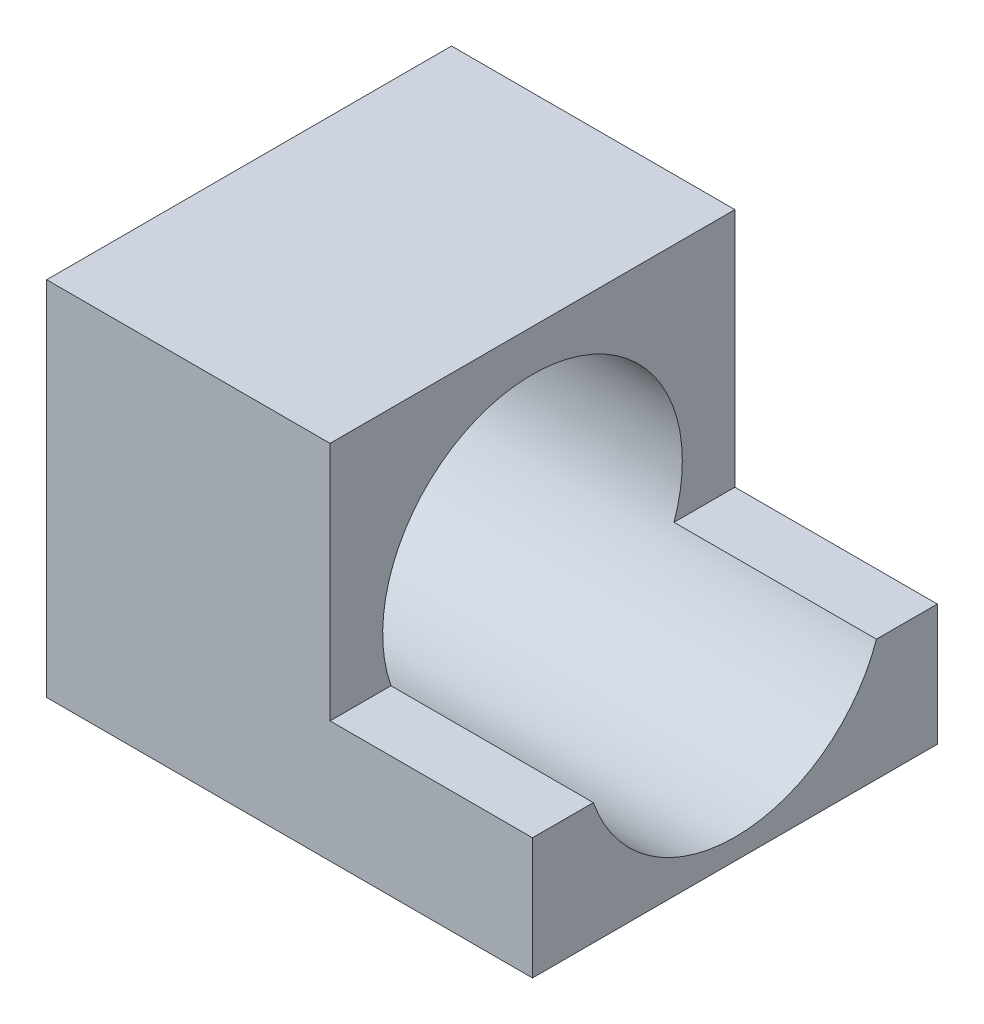
ISO-10303-21;
HEADER;
FILE_DESCRIPTION(('STEP AP214'),'2;1');
FILE_NAME('part.step','',(''),(''),'','','');
FILE_SCHEMA(('AUTOMOTIVE_DESIGN { 1 0 10303 214 1 1 1 1 }'));
ENDSEC;
DATA;
#1=APPLICATION_CONTEXT('core data for automotive mechanical design processes');
#2=APPLICATION_PROTOCOL_DEFINITION('international standard','automotive_design',2000,#1);
#3=PRODUCT_CONTEXT('',#1,'mechanical');
#4=PRODUCT('Part','Part','',(#3));
#5=PRODUCT_RELATED_PRODUCT_CATEGORY('part','',(#4));
#6=PRODUCT_DEFINITION_FORMATION('','',#4);
#7=PRODUCT_DEFINITION_CONTEXT('part definition',#1,'design');
#8=PRODUCT_DEFINITION('design','',#6,#7);
#9=PRODUCT_DEFINITION_SHAPE('','',#8);
#10=(LENGTH_UNIT() NAMED_UNIT(*) SI_UNIT(.MILLI.,.METRE.));
#11=(NAMED_UNIT(*) PLANE_ANGLE_UNIT() SI_UNIT($,.RADIAN.));
#12=(NAMED_UNIT(*) SI_UNIT($,.STERADIAN.) SOLID_ANGLE_UNIT());
#13=UNCERTAINTY_MEASURE_WITH_UNIT(LENGTH_MEASURE(1.E-05),#10,'distance_accuracy_value','');
#14=(GEOMETRIC_REPRESENTATION_CONTEXT(3) GLOBAL_UNCERTAINTY_ASSIGNED_CONTEXT((#13)) GLOBAL_UNIT_ASSIGNED_CONTEXT((#10,
#11,#12)) REPRESENTATION_CONTEXT('',''));
#15=CARTESIAN_POINT('',(0.,0.,0.));
#16=DIRECTION('',(0.,0.,1.));
#17=DIRECTION('',(1.,0.,0.));
#18=AXIS2_PLACEMENT_3D('',#15,#16,#17);
#19=CARTESIAN_POINT('',(0.,43.815,0.));
#20=DIRECTION('',(0.,-1.,0.));
#21=DIRECTION('',(0.,0.,-1.));
#22=AXIS2_PLACEMENT_3D('',#19,#20,#21);
#23=PLANE('',#22);
#24=DIRECTION('',(0.,0.,1.));
#25=VECTOR('',#24,1.);
#26=CARTESIAN_POINT('',(5.08,43.815,25.4));
#27=LINE('',#26,#25);
#28=CARTESIAN_POINT('',(5.07999999999998,43.815,-25.4));
#29=VERTEX_POINT('',#28);
#30=CARTESIAN_POINT('',(5.08,43.815,25.4));
#31=VERTEX_POINT('',#30);
#32=EDGE_CURVE('E122',#29,#31,#27,.T.);
#33=ORIENTED_EDGE('',*,*,#32,.F.);
#34=DIRECTION('',(-1.,0.,0.));
#35=VECTOR('',#34,1.);
#36=CARTESIAN_POINT('',(-30.48,43.815,-25.4));
#37=LINE('',#36,#35);
#38=CARTESIAN_POINT('',(-30.48,43.815,-25.4));
#39=VERTEX_POINT('',#38);
#40=EDGE_CURVE('E61',#29,#39,#37,.T.);
#41=ORIENTED_EDGE('',*,*,#40,.T.);
#42=DIRECTION('',(0.,0.,1.));
#43=VECTOR('',#42,1.);
#44=CARTESIAN_POINT('',(-30.48,43.815,25.4));
#45=LINE('',#44,#43);
#46=CARTESIAN_POINT('',(-30.48,43.815,25.4));
#47=VERTEX_POINT('',#46);
#48=EDGE_CURVE('E211',#39,#47,#45,.T.);
#49=ORIENTED_EDGE('',*,*,#48,.T.);
#50=DIRECTION('',(1.,0.,0.));
#51=VECTOR('',#50,1.);
#52=CARTESIAN_POINT('',(-30.48,43.815,25.4));
#53=LINE('',#52,#51);
#54=EDGE_CURVE('E209',#47,#31,#53,.T.);
#55=ORIENTED_EDGE('',*,*,#54,.T.);
#56=EDGE_LOOP('',(#33,#41,#49,#55));
#57=FACE_BOUND('',#56,.T.);
#58=ADVANCED_FACE('F38',(#57),#23,.F.);
#59=CARTESIAN_POINT('',(0.,-10.4775,0.));
#60=DIRECTION('',(0.,1.,0.));
#61=DIRECTION('',(0.,0.,1.));
#62=AXIS2_PLACEMENT_3D('',#59,#60,#61);
#63=CYLINDRICAL_SURFACE('',#62,4.7625);
#64=CARTESIAN_POINT('',(0.,-1.5875,0.));
#65=DIRECTION('',(0.,1.,0.));
#66=DIRECTION('',(0.,0.,1.));
#67=AXIS2_PLACEMENT_3D('',#64,#65,#66);
#68=CIRCLE('',#67,4.7625);
#69=CARTESIAN_POINT('',(0.,-1.5875,4.7625));
#70=VERTEX_POINT('',#69);
#71=EDGE_CURVE('E178',#70,#70,#68,.F.);
#72=ORIENTED_EDGE('',*,*,#71,.T.);
#73=EDGE_LOOP('',(#72));
#74=FACE_BOUND('',#73,.T.);
#75=CARTESIAN_POINT('',(0.,-6.4135,0.));
#76=DIRECTION('',(0.,-1.,0.));
#77=DIRECTION('',(0.,0.,-1.));
#78=AXIS2_PLACEMENT_3D('',#75,#76,#77);
#79=CIRCLE('',#78,4.7625);
#80=CARTESIAN_POINT('',(0.,-6.4135,-4.7625));
#81=VERTEX_POINT('',#80);
#82=EDGE_CURVE('E175',#81,#81,#79,.T.);
#83=ORIENTED_EDGE('',*,*,#82,.F.);
#84=EDGE_LOOP('',(#83));
#85=FACE_BOUND('',#84,.T.);
#86=ADVANCED_FACE('F40',(#74,#85),#63,.T.);
#87=CARTESIAN_POINT('',(-30.48,40.64,-25.4));
#88=DIRECTION('',(1.,0.,0.));
#89=DIRECTION('',(0.,0.,-1.));
#90=AXIS2_PLACEMENT_3D('',#87,#88,#89);
#91=PLANE('',#90);
#92=CARTESIAN_POINT('',(-30.48,10.9731652217331,8.83883477826688));
#93=DIRECTION('',(-1.,0.,0.));
#94=DIRECTION('',(0.,0.,1.));
#95=AXIS2_PLACEMENT_3D('',#92,#93,#94);
#96=CIRCLE('',#95,2.54);
#97=CARTESIAN_POINT('',(-30.48,10.9731652217331,11.3788347782669));
#98=VERTEX_POINT('',#97);
#99=EDGE_CURVE('E141',#98,#98,#96,.T.);
#100=ORIENTED_EDGE('',*,*,#99,.F.);
#101=EDGE_LOOP('',(#100));
#102=FACE_BOUND('',#101,.T.);
#103=CARTESIAN_POINT('',(-30.48,10.9731652217331,-8.83883477826688));
#104=DIRECTION('',(-1.,0.,0.));
#105=DIRECTION('',(0.,0.,1.));
#106=AXIS2_PLACEMENT_3D('',#103,#104,#105);
#107=CIRCLE('',#106,2.54);
#108=CARTESIAN_POINT('',(-30.48,10.9731652217331,-6.29883477826687));
#109=VERTEX_POINT('',#108);
#110=EDGE_CURVE('E150',#109,#109,#107,.T.);
#111=ORIENTED_EDGE('',*,*,#110,.F.);
#112=EDGE_LOOP('',(#111));
#113=FACE_BOUND('',#112,.T.);
#114=CARTESIAN_POINT('',(-30.48,28.6508347782669,-8.83883477826688));
#115=DIRECTION('',(-1.,0.,0.));
#116=DIRECTION('',(0.,0.,1.));
#117=AXIS2_PLACEMENT_3D('',#114,#115,#116);
#118=CIRCLE('',#117,2.54);
#119=CARTESIAN_POINT('',(-30.48,28.6508347782669,-6.29883477826687));
#120=VERTEX_POINT('',#119);
#121=EDGE_CURVE('E142',#120,#120,#118,.T.);
#122=ORIENTED_EDGE('',*,*,#121,.F.);
#123=EDGE_LOOP('',(#122));
#124=FACE_BOUND('',#123,.T.);
#125=CARTESIAN_POINT('',(-30.48,28.6508347782669,8.83883477826688));
#126=DIRECTION('',(-1.,0.,0.));
#127=DIRECTION('',(0.,0.,1.));
#128=AXIS2_PLACEMENT_3D('',#125,#126,#127);
#129=CIRCLE('',#128,2.54);
#130=CARTESIAN_POINT('',(-30.48,28.6508347782669,11.3788347782669));
#131=VERTEX_POINT('',#130);
#132=EDGE_CURVE('E149',#131,#131,#129,.T.);
#133=ORIENTED_EDGE('',*,*,#132,.F.);
#134=EDGE_LOOP('',(#133));
#135=FACE_BOUND('',#134,.T.);
#136=CARTESIAN_POINT('',(-30.48,32.312000019,0.));
#137=DIRECTION('',(-1.,0.,0.));
#138=DIRECTION('',(0.,0.,1.));
#139=AXIS2_PLACEMENT_3D('',#136,#137,#138);
#140=CIRCLE('',#139,1.5);
#141=CARTESIAN_POINT('',(-30.48,32.312000019,1.5));
#142=VERTEX_POINT('',#141);
#143=EDGE_CURVE('E181',#142,#142,#140,.T.);
#144=ORIENTED_EDGE('',*,*,#143,.F.);
#145=EDGE_LOOP('',(#144));
#146=FACE_BOUND('',#145,.T.);
#147=CARTESIAN_POINT('',(-30.48,7.311999981,0.));
#148=DIRECTION('',(-1.,0.,0.));
#149=DIRECTION('',(0.,0.,1.));
#150=AXIS2_PLACEMENT_3D('',#147,#148,#149);
#151=CIRCLE('',#150,1.5);
#152=CARTESIAN_POINT('',(-30.48,7.311999981,1.5));
#153=VERTEX_POINT('',#152);
#154=EDGE_CURVE('E219',#153,#153,#151,.T.);
#155=ORIENTED_EDGE('',*,*,#154,.F.);
#156=EDGE_LOOP('',(#155));
#157=FACE_BOUND('',#156,.T.);
#158=CARTESIAN_POINT('',(-30.48,19.812,0.));
#159=DIRECTION('',(-1.,0.,0.));
#160=DIRECTION('',(0.,0.,1.));
#161=AXIS2_PLACEMENT_3D('',#158,#159,#160);
#162=CIRCLE('',#161,9.144);
#163=CARTESIAN_POINT('',(-30.48,19.812,9.144));
#164=VERTEX_POINT('',#163);
#165=EDGE_CURVE('E208',#164,#164,#162,.T.);
#166=ORIENTED_EDGE('',*,*,#165,.F.);
#167=EDGE_LOOP('',(#166));
#168=FACE_BOUND('',#167,.T.);
#169=DIRECTION('',(0.,-1.,0.));
#170=VECTOR('',#169,1.);
#171=CARTESIAN_POINT('',(-30.48,40.64,-25.4));
#172=LINE('',#171,#170);
#173=CARTESIAN_POINT('',(-30.48,-1.5875,-25.4));
#174=VERTEX_POINT('',#173);
#175=EDGE_CURVE('E81',#39,#174,#172,.T.);
#176=ORIENTED_EDGE('',*,*,#175,.T.);
#177=DIRECTION('',(0.,0.,-1.));
#178=VECTOR('',#177,1.);
#179=CARTESIAN_POINT('',(-30.48,-1.5875,25.4));
#180=LINE('',#179,#178);
#181=CARTESIAN_POINT('',(-30.48,-1.5875,25.4));
#182=VERTEX_POINT('',#181);
#183=EDGE_CURVE('E194',#182,#174,#180,.T.);
#184=ORIENTED_EDGE('',*,*,#183,.F.);
#185=DIRECTION('',(0.,-1.,0.));
#186=VECTOR('',#185,1.);
#187=CARTESIAN_POINT('',(-30.48,40.64,25.4));
#188=LINE('',#187,#186);
#189=EDGE_CURVE('E76',#47,#182,#188,.T.);
#190=ORIENTED_EDGE('',*,*,#189,.F.);
#191=ORIENTED_EDGE('',*,*,#48,.F.);
#192=EDGE_LOOP('',(#176,#184,#190,#191));
#193=FACE_BOUND('',#192,.T.);
#194=ADVANCED_FACE('F245',(#102,#113,#124,#135,#146,#157,#168,#193),#91,.F.);
#195=CARTESIAN_POINT('',(-30.48,40.64,25.4));
#196=DIRECTION('',(0.,0.,-1.));
#197=DIRECTION('',(-1.,0.,0.));
#198=AXIS2_PLACEMENT_3D('',#195,#196,#197);
#199=PLANE('',#198);
#200=DIRECTION('',(0.,-1.,0.));
#201=VECTOR('',#200,1.);
#202=CARTESIAN_POINT('',(30.48,40.64,25.4));
#203=LINE('',#202,#201);
#204=CARTESIAN_POINT('',(30.48,13.6525,25.4));
#205=VERTEX_POINT('',#204);
#206=CARTESIAN_POINT('',(30.48,-1.5875,25.4));
#207=VERTEX_POINT('',#206);
#208=EDGE_CURVE('E131',#205,#207,#203,.T.);
#209=ORIENTED_EDGE('',*,*,#208,.F.);
#210=DIRECTION('',(1.,0.,0.));
#211=VECTOR('',#210,1.);
#212=CARTESIAN_POINT('',(5.08,13.6525,25.4));
#213=LINE('',#212,#211);
#214=CARTESIAN_POINT('',(5.08,13.6525,25.4));
#215=VERTEX_POINT('',#214);
#216=EDGE_CURVE('E113',#215,#205,#213,.T.);
#217=ORIENTED_EDGE('',*,*,#216,.F.);
#218=DIRECTION('',(0.,-1.,0.));
#219=VECTOR('',#218,1.);
#220=CARTESIAN_POINT('',(5.08,43.815,25.4));
#221=LINE('',#220,#219);
#222=EDGE_CURVE('E120',#31,#215,#221,.T.);
#223=ORIENTED_EDGE('',*,*,#222,.F.);
#224=ORIENTED_EDGE('',*,*,#54,.F.);
#225=ORIENTED_EDGE('',*,*,#189,.T.);
#226=DIRECTION('',(-1.,0.,0.));
#227=VECTOR('',#226,1.);
#228=CARTESIAN_POINT('',(30.48,-1.5875,25.4));
#229=LINE('',#228,#227);
#230=EDGE_CURVE('E196',#207,#182,#229,.T.);
#231=ORIENTED_EDGE('',*,*,#230,.F.);
#232=EDGE_LOOP('',(#209,#217,#223,#224,#225,#231));
#233=FACE_BOUND('',#232,.T.);
#234=ADVANCED_FACE('F128',(#233),#199,.F.);
#235=CARTESIAN_POINT('',(30.48,40.64,-25.4));
#236=DIRECTION('',(-1.,0.,0.));
#237=DIRECTION('',(0.,0.,1.));
#238=AXIS2_PLACEMENT_3D('',#235,#236,#237);
#239=PLANE('',#238);
#240=DIRECTION('',(0.,-1.,0.));
#241=VECTOR('',#240,1.);
#242=CARTESIAN_POINT('',(30.48,40.64,-25.4));
#243=LINE('',#242,#241);
#244=CARTESIAN_POINT('',(30.48,13.6525,-25.4));
#245=VERTEX_POINT('',#244);
#246=CARTESIAN_POINT('',(30.48,-1.5875,-25.4));
#247=VERTEX_POINT('',#246);
#248=EDGE_CURVE('E186',#245,#247,#243,.T.);
#249=ORIENTED_EDGE('',*,*,#248,.F.);
#250=DIRECTION('',(0.,0.,-1.));
#251=VECTOR('',#250,1.);
#252=CARTESIAN_POINT('',(30.48,13.6525,25.4));
#253=LINE('',#252,#251);
#254=CARTESIAN_POINT('',(30.48,13.6525,-17.7623354249941));
#255=VERTEX_POINT('',#254);
#256=EDGE_CURVE('E235',#255,#245,#253,.T.);
#257=ORIENTED_EDGE('',*,*,#256,.F.);
#258=CARTESIAN_POINT('',(30.48,19.812,0.));
#259=DIRECTION('',(1.,0.,0.));
#260=DIRECTION('',(0.,0.,-1.));
#261=AXIS2_PLACEMENT_3D('',#258,#259,#260);
#262=CIRCLE('',#261,18.8);
#263=CARTESIAN_POINT('',(30.48,13.6525,17.7623354249941));
#264=VERTEX_POINT('',#263);
#265=EDGE_CURVE('E203',#264,#255,#262,.T.);
#266=ORIENTED_EDGE('',*,*,#265,.F.);
#267=EDGE_CURVE('E125',#205,#264,#253,.T.);
#268=ORIENTED_EDGE('',*,*,#267,.F.);
#269=ORIENTED_EDGE('',*,*,#208,.T.);
#270=DIRECTION('',(0.,0.,1.));
#271=VECTOR('',#270,1.);
#272=CARTESIAN_POINT('',(30.48,-1.5875,25.4));
#273=LINE('',#272,#271);
#274=EDGE_CURVE('E188',#247,#207,#273,.T.);
#275=ORIENTED_EDGE('',*,*,#274,.F.);
#276=EDGE_LOOP('',(#249,#257,#266,#268,#269,#275));
#277=FACE_BOUND('',#276,.T.);
#278=ADVANCED_FACE('F234',(#277),#239,.F.);
#279=CARTESIAN_POINT('',(-30.48,40.64,-25.4));
#280=DIRECTION('',(0.,0.,1.));
#281=DIRECTION('',(1.,0.,0.));
#282=AXIS2_PLACEMENT_3D('',#279,#280,#281);
#283=PLANE('',#282);
#284=DIRECTION('',(0.,1.,0.));
#285=VECTOR('',#284,1.);
#286=CARTESIAN_POINT('',(5.08,43.815,-25.4));
#287=LINE('',#286,#285);
#288=CARTESIAN_POINT('',(5.08,13.6525,-25.4));
#289=VERTEX_POINT('',#288);
#290=EDGE_CURVE('E53',#289,#29,#287,.T.);
#291=ORIENTED_EDGE('',*,*,#290,.F.);
#292=DIRECTION('',(1.,0.,0.));
#293=VECTOR('',#292,1.);
#294=CARTESIAN_POINT('',(5.08,13.6525,-25.4));
#295=LINE('',#294,#293);
#296=EDGE_CURVE('E132',#289,#245,#295,.T.);
#297=ORIENTED_EDGE('',*,*,#296,.T.);
#298=ORIENTED_EDGE('',*,*,#248,.T.);
#299=DIRECTION('',(1.,0.,0.));
#300=VECTOR('',#299,1.);
#301=CARTESIAN_POINT('',(30.48,-1.5875,-25.4));
#302=LINE('',#301,#300);
#303=EDGE_CURVE('E190',#174,#247,#302,.T.);
#304=ORIENTED_EDGE('',*,*,#303,.F.);
#305=ORIENTED_EDGE('',*,*,#175,.F.);
#306=ORIENTED_EDGE('',*,*,#40,.F.);
#307=EDGE_LOOP('',(#291,#297,#298,#304,#305,#306));
#308=FACE_BOUND('',#307,.T.);
#309=ADVANCED_FACE('F243',(#308),#283,.F.);
#310=CARTESIAN_POINT('',(0.,-1.5875,0.));
#311=DIRECTION('',(0.,1.,0.));
#312=DIRECTION('',(0.,0.,1.));
#313=AXIS2_PLACEMENT_3D('',#310,#311,#312);
#314=PLANE('',#313);
#315=ORIENTED_EDGE('',*,*,#71,.F.);
#316=EDGE_LOOP('',(#315));
#317=FACE_BOUND('',#316,.T.);
#318=ORIENTED_EDGE('',*,*,#274,.T.);
#319=ORIENTED_EDGE('',*,*,#230,.T.);
#320=ORIENTED_EDGE('',*,*,#183,.T.);
#321=ORIENTED_EDGE('',*,*,#303,.T.);
#322=EDGE_LOOP('',(#318,#319,#320,#321));
#323=FACE_BOUND('',#322,.T.);
#324=ADVANCED_FACE('F247',(#317,#323),#314,.F.);
#325=CARTESIAN_POINT('',(-83.6544299452284,19.812,0.));
#326=DIRECTION('',(1.,0.,0.));
#327=DIRECTION('',(0.,0.,-1.));
#328=AXIS2_PLACEMENT_3D('',#325,#326,#327);
#329=CYLINDRICAL_SURFACE('',#328,18.8);
#330=ORIENTED_EDGE('',*,*,#265,.T.);
#331=DIRECTION('',(1.,0.,0.));
#332=VECTOR('',#331,1.);
#333=CARTESIAN_POINT('',(-83.6544299452284,13.6525,-17.7623354249941));
#334=LINE('',#333,#332);
#335=CARTESIAN_POINT('',(5.08,13.6525,-17.7623354249941));
#336=VERTEX_POINT('',#335);
#337=EDGE_CURVE('E12',#255,#336,#334,.F.);
#338=ORIENTED_EDGE('',*,*,#337,.T.);
#339=CARTESIAN_POINT('',(5.08,19.812,0.));
#340=DIRECTION('',(1.,0.,0.));
#341=DIRECTION('',(0.,0.,-1.));
#342=AXIS2_PLACEMENT_3D('',#339,#340,#341);
#343=CIRCLE('',#342,18.8);
#344=CARTESIAN_POINT('',(5.08,13.6525,17.7623354249941));
#345=VERTEX_POINT('',#344);
#346=EDGE_CURVE('E135',#345,#336,#343,.F.);
#347=ORIENTED_EDGE('',*,*,#346,.F.);
#348=DIRECTION('',(1.,0.,0.));
#349=VECTOR('',#348,1.);
#350=CARTESIAN_POINT('',(-83.6544299452284,13.6525,17.7623354249941));
#351=LINE('',#350,#349);
#352=EDGE_CURVE('E46',#345,#264,#351,.T.);
#353=ORIENTED_EDGE('',*,*,#352,.T.);
#354=EDGE_LOOP('',(#330,#338,#347,#353));
#355=FACE_BOUND('',#354,.T.);
#356=CARTESIAN_POINT('',(-27.305,19.812,0.));
#357=DIRECTION('',(1.,0.,0.));
#358=DIRECTION('',(0.,0.,-1.));
#359=AXIS2_PLACEMENT_3D('',#356,#357,#358);
#360=CIRCLE('',#359,18.8);
#361=CARTESIAN_POINT('',(-27.305,19.812,-18.8));
#362=VERTEX_POINT('',#361);
#363=EDGE_CURVE('E193',#362,#362,#360,.F.);
#364=ORIENTED_EDGE('',*,*,#363,.T.);
#365=EDGE_LOOP('',(#364));
#366=FACE_BOUND('',#365,.T.);
#367=ADVANCED_FACE('F229',(#355,#366),#329,.F.);
#368=CARTESIAN_POINT('',(-27.305,40.64,-25.4));
#369=DIRECTION('',(1.,0.,0.));
#370=DIRECTION('',(0.,0.,-1.));
#371=AXIS2_PLACEMENT_3D('',#368,#369,#370);
#372=PLANE('',#371);
#373=CARTESIAN_POINT('',(-27.305,10.9731652217331,8.83883477826688));
#374=DIRECTION('',(1.,0.,0.));
#375=DIRECTION('',(0.,0.,-1.));
#376=AXIS2_PLACEMENT_3D('',#373,#374,#375);
#377=CIRCLE('',#376,2.54);
#378=CARTESIAN_POINT('',(-27.305,10.9731652217331,6.29883477826688));
#379=VERTEX_POINT('',#378);
#380=EDGE_CURVE('E153',#379,#379,#377,.F.);
#381=ORIENTED_EDGE('',*,*,#380,.T.);
#382=EDGE_LOOP('',(#381));
#383=FACE_BOUND('',#382,.T.);
#384=CARTESIAN_POINT('',(-27.305,10.9731652217331,-8.83883477826688));
#385=DIRECTION('',(1.,0.,0.));
#386=DIRECTION('',(0.,0.,-1.));
#387=AXIS2_PLACEMENT_3D('',#384,#385,#386);
#388=CIRCLE('',#387,2.54);
#389=CARTESIAN_POINT('',(-27.305,10.9731652217331,-11.3788347782669));
#390=VERTEX_POINT('',#389);
#391=EDGE_CURVE('E146',#390,#390,#388,.F.);
#392=ORIENTED_EDGE('',*,*,#391,.T.);
#393=EDGE_LOOP('',(#392));
#394=FACE_BOUND('',#393,.T.);
#395=CARTESIAN_POINT('',(-27.305,28.6508347782669,-8.83883477826688));
#396=DIRECTION('',(1.,0.,0.));
#397=DIRECTION('',(0.,0.,-1.));
#398=AXIS2_PLACEMENT_3D('',#395,#396,#397);
#399=CIRCLE('',#398,2.54);
#400=CARTESIAN_POINT('',(-27.305,28.6508347782669,-11.3788347782669));
#401=VERTEX_POINT('',#400);
#402=EDGE_CURVE('E145',#401,#401,#399,.F.);
#403=ORIENTED_EDGE('',*,*,#402,.T.);
#404=EDGE_LOOP('',(#403));
#405=FACE_BOUND('',#404,.T.);
#406=CARTESIAN_POINT('',(-27.305,28.6508347782669,8.83883477826688));
#407=DIRECTION('',(1.,0.,0.));
#408=DIRECTION('',(0.,0.,-1.));
#409=AXIS2_PLACEMENT_3D('',#406,#407,#408);
#410=CIRCLE('',#409,2.54);
#411=CARTESIAN_POINT('',(-27.305,28.6508347782669,6.29883477826688));
#412=VERTEX_POINT('',#411);
#413=EDGE_CURVE('E162',#412,#412,#410,.F.);
#414=ORIENTED_EDGE('',*,*,#413,.T.);
#415=EDGE_LOOP('',(#414));
#416=FACE_BOUND('',#415,.T.);
#417=CARTESIAN_POINT('',(-27.305,32.312000019,0.));
#418=DIRECTION('',(1.,0.,0.));
#419=DIRECTION('',(0.,0.,-1.));
#420=AXIS2_PLACEMENT_3D('',#417,#418,#419);
#421=CIRCLE('',#420,1.5);
#422=CARTESIAN_POINT('',(-27.305,32.312000019,1.5));
#423=VERTEX_POINT('',#422);
#424=EDGE_CURVE('E206',#423,#423,#421,.F.);
#425=ORIENTED_EDGE('',*,*,#424,.T.);
#426=EDGE_LOOP('',(#425));
#427=FACE_BOUND('',#426,.T.);
#428=CARTESIAN_POINT('',(-27.305,7.311999981,0.));
#429=DIRECTION('',(1.,0.,0.));
#430=DIRECTION('',(0.,0.,-1.));
#431=AXIS2_PLACEMENT_3D('',#428,#429,#430);
#432=CIRCLE('',#431,1.5);
#433=CARTESIAN_POINT('',(-27.305,7.311999981,1.5));
#434=VERTEX_POINT('',#433);
#435=EDGE_CURVE('E216',#434,#434,#432,.F.);
#436=ORIENTED_EDGE('',*,*,#435,.T.);
#437=EDGE_LOOP('',(#436));
#438=FACE_BOUND('',#437,.T.);
#439=CARTESIAN_POINT('',(-27.305,19.812,0.));
#440=DIRECTION('',(1.,0.,0.));
#441=DIRECTION('',(0.,0.,-1.));
#442=AXIS2_PLACEMENT_3D('',#439,#440,#441);
#443=CIRCLE('',#442,9.144);
#444=CARTESIAN_POINT('',(-27.305,19.812,-9.144));
#445=VERTEX_POINT('',#444);
#446=EDGE_CURVE('E213',#445,#445,#443,.F.);
#447=ORIENTED_EDGE('',*,*,#446,.T.);
#448=EDGE_LOOP('',(#447));
#449=FACE_BOUND('',#448,.T.);
#450=ORIENTED_EDGE('',*,*,#363,.F.);
#451=EDGE_LOOP('',(#450));
#452=FACE_BOUND('',#451,.T.);
#453=ADVANCED_FACE('F255',(#383,#394,#405,#416,#427,#438,#449,#452),#372,.T.);
#454=CARTESIAN_POINT('',(-1.44186237132084,19.812,0.));
#455=DIRECTION('',(-1.,0.,0.));
#456=DIRECTION('',(0.,0.,1.));
#457=AXIS2_PLACEMENT_3D('',#454,#455,#456);
#458=CYLINDRICAL_SURFACE('',#457,9.144);
#459=ORIENTED_EDGE('',*,*,#165,.T.);
#460=EDGE_LOOP('',(#459));
#461=FACE_BOUND('',#460,.T.);
#462=ORIENTED_EDGE('',*,*,#446,.F.);
#463=EDGE_LOOP('',(#462));
#464=FACE_BOUND('',#463,.T.);
#465=ADVANCED_FACE('F267',(#461,#464),#458,.F.);
#466=CARTESIAN_POINT('',(-23.0623593128807,7.311999981,0.));
#467=DIRECTION('',(-1.,0.,0.));
#468=DIRECTION('',(0.,0.,1.));
#469=AXIS2_PLACEMENT_3D('',#466,#467,#468);
#470=CYLINDRICAL_SURFACE('',#469,1.5);
#471=CARTESIAN_POINT('',(-30.48,7.311999981,1.5));
#472=CARTESIAN_POINT('',(-30.4469270833333,7.311999981,1.5));
#473=CARTESIAN_POINT('',(-30.4138541666667,7.311999981,1.5));
#474=CARTESIAN_POINT('',(-30.3477083333333,7.311999981,1.5));
#475=CARTESIAN_POINT('',(-30.3146354166667,7.311999981,1.5));
#476=CARTESIAN_POINT('',(-30.2484895833333,7.311999981,1.5));
#477=CARTESIAN_POINT('',(-30.2154166666667,7.311999981,1.5));
#478=CARTESIAN_POINT('',(-30.1492708333333,7.311999981,1.5));
#479=CARTESIAN_POINT('',(-30.1161979166667,7.311999981,1.5));
#480=CARTESIAN_POINT('',(-30.0500520833333,7.311999981,1.5));
#481=CARTESIAN_POINT('',(-30.0169791666667,7.311999981,1.5));
#482=CARTESIAN_POINT('',(-29.9508333333333,7.311999981,1.5));
#483=CARTESIAN_POINT('',(-29.9177604166667,7.311999981,1.5));
#484=CARTESIAN_POINT('',(-29.8516145833333,7.311999981,1.5));
#485=CARTESIAN_POINT('',(-29.8185416666667,7.311999981,1.5));
#486=CARTESIAN_POINT('',(-29.7523958333333,7.311999981,1.5));
#487=CARTESIAN_POINT('',(-29.7193229166667,7.311999981,1.5));
#488=CARTESIAN_POINT('',(-29.6531770833333,7.311999981,1.5));
#489=CARTESIAN_POINT('',(-29.6201041666667,7.311999981,1.5));
#490=CARTESIAN_POINT('',(-29.5539583333333,7.311999981,1.5));
#491=CARTESIAN_POINT('',(-29.5208854166667,7.311999981,1.5));
#492=CARTESIAN_POINT('',(-29.4547395833333,7.311999981,1.5));
#493=CARTESIAN_POINT('',(-29.4216666666667,7.311999981,1.5));
#494=CARTESIAN_POINT('',(-29.3555208333333,7.311999981,1.5));
#495=CARTESIAN_POINT('',(-29.3224479166667,7.311999981,1.5));
#496=CARTESIAN_POINT('',(-29.2563020833333,7.311999981,1.5));
#497=CARTESIAN_POINT('',(-29.2232291666667,7.311999981,1.5));
#498=CARTESIAN_POINT('',(-29.1570833333333,7.311999981,1.5));
#499=CARTESIAN_POINT('',(-29.1240104166667,7.311999981,1.5));
#500=CARTESIAN_POINT('',(-29.0578645833333,7.311999981,1.5));
#501=CARTESIAN_POINT('',(-29.0247916666667,7.311999981,1.5));
#502=CARTESIAN_POINT('',(-28.9586458333333,7.311999981,1.5));
#503=CARTESIAN_POINT('',(-28.9255729166667,7.311999981,1.5));
#504=CARTESIAN_POINT('',(-28.8594270833333,7.311999981,1.5));
#505=CARTESIAN_POINT('',(-28.8263541666667,7.311999981,1.5));
#506=CARTESIAN_POINT('',(-28.7602083333333,7.311999981,1.5));
#507=CARTESIAN_POINT('',(-28.7271354166667,7.311999981,1.5));
#508=CARTESIAN_POINT('',(-28.6609895833333,7.311999981,1.5));
#509=CARTESIAN_POINT('',(-28.6279166666667,7.311999981,1.5));
#510=CARTESIAN_POINT('',(-28.5617708333333,7.311999981,1.5));
#511=CARTESIAN_POINT('',(-28.5286979166667,7.311999981,1.5));
#512=CARTESIAN_POINT('',(-28.4625520833333,7.311999981,1.5));
#513=CARTESIAN_POINT('',(-28.4294791666667,7.311999981,1.5));
#514=CARTESIAN_POINT('',(-28.3633333333333,7.311999981,1.5));
#515=CARTESIAN_POINT('',(-28.3302604166667,7.311999981,1.5));
#516=CARTESIAN_POINT('',(-28.2641145833333,7.311999981,1.5));
#517=CARTESIAN_POINT('',(-28.2310416666667,7.311999981,1.5));
#518=CARTESIAN_POINT('',(-28.1648958333333,7.311999981,1.5));
#519=CARTESIAN_POINT('',(-28.1318229166667,7.311999981,1.5));
#520=CARTESIAN_POINT('',(-28.0656770833333,7.311999981,1.5));
#521=CARTESIAN_POINT('',(-28.0326041666667,7.311999981,1.5));
#522=CARTESIAN_POINT('',(-27.9664583333333,7.311999981,1.5));
#523=CARTESIAN_POINT('',(-27.9333854166667,7.311999981,1.5));
#524=CARTESIAN_POINT('',(-27.8672395833333,7.311999981,1.5));
#525=CARTESIAN_POINT('',(-27.8341666666667,7.311999981,1.5));
#526=CARTESIAN_POINT('',(-27.7680208333333,7.311999981,1.5));
#527=CARTESIAN_POINT('',(-27.7349479166667,7.311999981,1.5));
#528=CARTESIAN_POINT('',(-27.6688020833333,7.311999981,1.5));
#529=CARTESIAN_POINT('',(-27.6357291666667,7.311999981,1.5));
#530=CARTESIAN_POINT('',(-27.5695833333333,7.311999981,1.5));
#531=CARTESIAN_POINT('',(-27.5365104166667,7.311999981,1.5));
#532=CARTESIAN_POINT('',(-27.4703645833333,7.311999981,1.5));
#533=CARTESIAN_POINT('',(-27.4372916666667,7.311999981,1.5));
#534=CARTESIAN_POINT('',(-27.3711458333333,7.311999981,1.5));
#535=CARTESIAN_POINT('',(-27.3380729166667,7.311999981,1.5));
#536=CARTESIAN_POINT('',(-27.305,7.311999981,1.5));
#537=B_SPLINE_CURVE_WITH_KNOTS('',3,(#471,#472,#473,#474,#475,#476,#477,#478,#479,#480,#481,
#482,#483,#484,#485,#486,#487,#488,#489,#490,#491,#492,#493,#494,#495,#496,#497,#498,#499,#500,
#501,#502,#503,#504,#505,#506,#507,#508,#509,#510,#511,#512,#513,#514,#515,#516,#517,#518,#519,
#520,#521,#522,#523,#524,#525,#526,#527,#528,#529,#530,#531,#532,#533,#534,#535,#536),
.UNSPECIFIED.,.F.,.F.,(4,2,2,2,2,2,2,2,2,2,2,2,2,2,2,2,2,2,2,2,2,2,2,2,2,2,2,2,2,2,2,2,4),(0.,
0.0992187500000012,0.198437499999999,0.29765625,0.396875000000001,0.496093749999999,0.5953125,
0.694531250000002,0.793749999999999,0.892968750000001,0.992187500000002,1.09140625,1.190625,
1.28984375,1.3890625,1.48828125,1.5875,1.68671875,1.7859375,1.88515625,1.984375,2.08359375,
2.1828125,2.28203125,2.38125,2.48046875,2.5796875,2.67890625,2.778125,2.87734375,2.9765625,
3.07578125,3.175),.UNSPECIFIED.);
#538=EDGE_CURVE('BSEAM270',#153,#434,#537,.T.);
#539=ORIENTED_EDGE('',*,*,#154,.T.);
#540=ORIENTED_EDGE('',*,*,#435,.F.);
#541=ORIENTED_EDGE('',*,*,#538,.T.);
#542=ORIENTED_EDGE('',*,*,#538,.F.);
#543=EDGE_LOOP('',(#539,#541,#540,#542));
#544=FACE_BOUND('',#543,.T.);
#545=ADVANCED_FACE('F270',(#544),#470,.F.);
#546=CARTESIAN_POINT('',(-23.0623593128807,32.312000019,0.));
#547=DIRECTION('',(-1.,0.,0.));
#548=DIRECTION('',(0.,0.,1.));
#549=AXIS2_PLACEMENT_3D('',#546,#547,#548);
#550=CYLINDRICAL_SURFACE('',#549,1.5);
#551=CARTESIAN_POINT('',(-30.48,32.312000019,1.5));
#552=CARTESIAN_POINT('',(-30.4469270833333,32.312000019,1.5));
#553=CARTESIAN_POINT('',(-30.4138541666667,32.312000019,1.5));
#554=CARTESIAN_POINT('',(-30.3477083333333,32.312000019,1.5));
#555=CARTESIAN_POINT('',(-30.3146354166667,32.312000019,1.5));
#556=CARTESIAN_POINT('',(-30.2484895833333,32.312000019,1.5));
#557=CARTESIAN_POINT('',(-30.2154166666667,32.312000019,1.5));
#558=CARTESIAN_POINT('',(-30.1492708333333,32.312000019,1.5));
#559=CARTESIAN_POINT('',(-30.1161979166667,32.312000019,1.5));
#560=CARTESIAN_POINT('',(-30.0500520833333,32.312000019,1.5));
#561=CARTESIAN_POINT('',(-30.0169791666667,32.312000019,1.5));
#562=CARTESIAN_POINT('',(-29.9508333333333,32.312000019,1.5));
#563=CARTESIAN_POINT('',(-29.9177604166667,32.312000019,1.5));
#564=CARTESIAN_POINT('',(-29.8516145833333,32.312000019,1.5));
#565=CARTESIAN_POINT('',(-29.8185416666667,32.312000019,1.5));
#566=CARTESIAN_POINT('',(-29.7523958333333,32.312000019,1.5));
#567=CARTESIAN_POINT('',(-29.7193229166667,32.312000019,1.5));
#568=CARTESIAN_POINT('',(-29.6531770833333,32.312000019,1.5));
#569=CARTESIAN_POINT('',(-29.6201041666667,32.312000019,1.5));
#570=CARTESIAN_POINT('',(-29.5539583333333,32.312000019,1.5));
#571=CARTESIAN_POINT('',(-29.5208854166667,32.312000019,1.5));
#572=CARTESIAN_POINT('',(-29.4547395833333,32.312000019,1.5));
#573=CARTESIAN_POINT('',(-29.4216666666667,32.312000019,1.5));
#574=CARTESIAN_POINT('',(-29.3555208333333,32.312000019,1.5));
#575=CARTESIAN_POINT('',(-29.3224479166667,32.312000019,1.5));
#576=CARTESIAN_POINT('',(-29.2563020833333,32.312000019,1.5));
#577=CARTESIAN_POINT('',(-29.2232291666667,32.312000019,1.5));
#578=CARTESIAN_POINT('',(-29.1570833333333,32.312000019,1.5));
#579=CARTESIAN_POINT('',(-29.1240104166667,32.312000019,1.5));
#580=CARTESIAN_POINT('',(-29.0578645833333,32.312000019,1.5));
#581=CARTESIAN_POINT('',(-29.0247916666667,32.312000019,1.5));
#582=CARTESIAN_POINT('',(-28.9586458333333,32.312000019,1.5));
#583=CARTESIAN_POINT('',(-28.9255729166667,32.312000019,1.5));
#584=CARTESIAN_POINT('',(-28.8594270833333,32.312000019,1.5));
#585=CARTESIAN_POINT('',(-28.8263541666667,32.312000019,1.5));
#586=CARTESIAN_POINT('',(-28.7602083333333,32.312000019,1.5));
#587=CARTESIAN_POINT('',(-28.7271354166667,32.312000019,1.5));
#588=CARTESIAN_POINT('',(-28.6609895833333,32.312000019,1.5));
#589=CARTESIAN_POINT('',(-28.6279166666667,32.312000019,1.5));
#590=CARTESIAN_POINT('',(-28.5617708333333,32.312000019,1.5));
#591=CARTESIAN_POINT('',(-28.5286979166667,32.312000019,1.5));
#592=CARTESIAN_POINT('',(-28.4625520833333,32.312000019,1.5));
#593=CARTESIAN_POINT('',(-28.4294791666667,32.312000019,1.5));
#594=CARTESIAN_POINT('',(-28.3633333333333,32.312000019,1.5));
#595=CARTESIAN_POINT('',(-28.3302604166667,32.312000019,1.5));
#596=CARTESIAN_POINT('',(-28.2641145833333,32.312000019,1.5));
#597=CARTESIAN_POINT('',(-28.2310416666667,32.312000019,1.5));
#598=CARTESIAN_POINT('',(-28.1648958333333,32.312000019,1.5));
#599=CARTESIAN_POINT('',(-28.1318229166667,32.312000019,1.5));
#600=CARTESIAN_POINT('',(-28.0656770833333,32.312000019,1.5));
#601=CARTESIAN_POINT('',(-28.0326041666667,32.312000019,1.5));
#602=CARTESIAN_POINT('',(-27.9664583333333,32.312000019,1.5));
#603=CARTESIAN_POINT('',(-27.9333854166667,32.312000019,1.5));
#604=CARTESIAN_POINT('',(-27.8672395833333,32.312000019,1.5));
#605=CARTESIAN_POINT('',(-27.8341666666667,32.312000019,1.5));
#606=CARTESIAN_POINT('',(-27.7680208333333,32.312000019,1.5));
#607=CARTESIAN_POINT('',(-27.7349479166667,32.312000019,1.5));
#608=CARTESIAN_POINT('',(-27.6688020833333,32.312000019,1.5));
#609=CARTESIAN_POINT('',(-27.6357291666667,32.312000019,1.5));
#610=CARTESIAN_POINT('',(-27.5695833333333,32.312000019,1.5));
#611=CARTESIAN_POINT('',(-27.5365104166667,32.312000019,1.5));
#612=CARTESIAN_POINT('',(-27.4703645833333,32.312000019,1.5));
#613=CARTESIAN_POINT('',(-27.4372916666667,32.312000019,1.5));
#614=CARTESIAN_POINT('',(-27.3711458333333,32.312000019,1.5));
#615=CARTESIAN_POINT('',(-27.3380729166667,32.312000019,1.5));
#616=CARTESIAN_POINT('',(-27.305,32.312000019,1.5));
#617=B_SPLINE_CURVE_WITH_KNOTS('',3,(#551,#552,#553,#554,#555,#556,#557,#558,#559,#560,#561,
#562,#563,#564,#565,#566,#567,#568,#569,#570,#571,#572,#573,#574,#575,#576,#577,#578,#579,#580,
#581,#582,#583,#584,#585,#586,#587,#588,#589,#590,#591,#592,#593,#594,#595,#596,#597,#598,#599,
#600,#601,#602,#603,#604,#605,#606,#607,#608,#609,#610,#611,#612,#613,#614,#615,#616),
.UNSPECIFIED.,.F.,.F.,(4,2,2,2,2,2,2,2,2,2,2,2,2,2,2,2,2,2,2,2,2,2,2,2,2,2,2,2,2,2,2,2,4),(0.,
0.0992187500000012,0.198437499999999,0.29765625,0.396875000000001,0.496093749999999,0.5953125,
0.694531250000002,0.793749999999999,0.892968750000001,0.992187500000002,1.09140625,1.190625,
1.28984375,1.3890625,1.48828125,1.5875,1.68671875,1.7859375,1.88515625,1.984375,2.08359375,
2.1828125,2.28203125,2.38125,2.48046875,2.5796875,2.67890625,2.778125,2.87734375,2.9765625,
3.07578125,3.175),.UNSPECIFIED.);
#618=EDGE_CURVE('BSEAM274',#142,#423,#617,.T.);
#619=ORIENTED_EDGE('',*,*,#143,.T.);
#620=ORIENTED_EDGE('',*,*,#424,.F.);
#621=ORIENTED_EDGE('',*,*,#618,.T.);
#622=ORIENTED_EDGE('',*,*,#618,.F.);
#623=EDGE_LOOP('',(#619,#621,#620,#622));
#624=FACE_BOUND('',#623,.T.);
#625=ADVANCED_FACE('F274',(#624),#550,.F.);
#626=CARTESIAN_POINT('',(0.,-6.4135,0.));
#627=DIRECTION('',(0.,-1.,0.));
#628=DIRECTION('',(0.,0.,-1.));
#629=AXIS2_PLACEMENT_3D('',#626,#627,#628);
#630=PLANE('',#629);
#631=CARTESIAN_POINT('',(0.,-6.4135,0.));
#632=DIRECTION('',(0.,-1.,0.));
#633=DIRECTION('',(0.,0.,-1.));
#634=AXIS2_PLACEMENT_3D('',#631,#632,#633);
#635=CIRCLE('',#634,4.4704);
#636=CARTESIAN_POINT('',(0.,-6.4135,-4.4704));
#637=VERTEX_POINT('',#636);
#638=EDGE_CURVE('E172',#637,#637,#635,.T.);
#639=ORIENTED_EDGE('',*,*,#638,.F.);
#640=EDGE_LOOP('',(#639));
#641=FACE_BOUND('',#640,.T.);
#642=ORIENTED_EDGE('',*,*,#82,.T.);
#643=EDGE_LOOP('',(#642));
#644=FACE_BOUND('',#643,.T.);
#645=ADVANCED_FACE('F277',(#641,#644),#630,.T.);
#646=CARTESIAN_POINT('',(0.,-19.7943006184654,0.));
#647=DIRECTION('',(0.,1.,0.));
#648=DIRECTION('',(0.,0.,1.));
#649=AXIS2_PLACEMENT_3D('',#646,#647,#648);
#650=CYLINDRICAL_SURFACE('',#649,4.4704);
#651=ORIENTED_EDGE('',*,*,#638,.T.);
#652=EDGE_LOOP('',(#651));
#653=FACE_BOUND('',#652,.T.);
#654=CARTESIAN_POINT('',(0.,-7.1501,0.));
#655=DIRECTION('',(0.,-1.,0.));
#656=DIRECTION('',(0.,0.,-1.));
#657=AXIS2_PLACEMENT_3D('',#654,#655,#656);
#658=CIRCLE('',#657,4.4704);
#659=CARTESIAN_POINT('',(0.,-7.1501,-4.4704));
#660=VERTEX_POINT('',#659);
#661=EDGE_CURVE('E169',#660,#660,#658,.T.);
#662=ORIENTED_EDGE('',*,*,#661,.F.);
#663=EDGE_LOOP('',(#662));
#664=FACE_BOUND('',#663,.T.);
#665=ADVANCED_FACE('F280',(#653,#664),#650,.T.);
#666=CARTESIAN_POINT('',(0.,-10.4775,0.));
#667=DIRECTION('',(0.,-1.,0.));
#668=DIRECTION('',(0.,0.,-1.));
#669=AXIS2_PLACEMENT_3D('',#666,#667,#668);
#670=PLANE('',#669);
#671=CARTESIAN_POINT('',(0.,-10.4775,0.));
#672=DIRECTION('',(0.,-1.,0.));
#673=DIRECTION('',(0.,0.,-1.));
#674=AXIS2_PLACEMENT_3D('',#671,#672,#673);
#675=CIRCLE('',#674,4.7625);
#676=CARTESIAN_POINT('',(0.,-10.4775,-4.7625));
#677=VERTEX_POINT('',#676);
#678=EDGE_CURVE('E166',#677,#677,#675,.T.);
#679=ORIENTED_EDGE('',*,*,#678,.T.);
#680=EDGE_LOOP('',(#679));
#681=FACE_BOUND('',#680,.T.);
#682=ADVANCED_FACE('F285',(#681),#670,.T.);
#683=CARTESIAN_POINT('',(0.,-10.4775,0.));
#684=DIRECTION('',(0.,1.,0.));
#685=DIRECTION('',(0.,0.,1.));
#686=AXIS2_PLACEMENT_3D('',#683,#684,#685);
#687=CYLINDRICAL_SURFACE('',#686,4.7625);
#688=CARTESIAN_POINT('',(0.,-7.1501,0.));
#689=DIRECTION('',(0.,-1.,0.));
#690=DIRECTION('',(0.,0.,-1.));
#691=AXIS2_PLACEMENT_3D('',#688,#689,#690);
#692=CIRCLE('',#691,4.7625);
#693=CARTESIAN_POINT('',(0.,-7.1501,-4.7625));
#694=VERTEX_POINT('',#693);
#695=EDGE_CURVE('E165',#694,#694,#692,.T.);
#696=ORIENTED_EDGE('',*,*,#695,.T.);
#697=EDGE_LOOP('',(#696));
#698=FACE_BOUND('',#697,.T.);
#699=ORIENTED_EDGE('',*,*,#678,.F.);
#700=EDGE_LOOP('',(#699));
#701=FACE_BOUND('',#700,.T.);
#702=ADVANCED_FACE('F299',(#698,#701),#687,.T.);
#703=CARTESIAN_POINT('',(0.,-7.1501,0.));
#704=DIRECTION('',(0.,-1.,0.));
#705=DIRECTION('',(0.,0.,-1.));
#706=AXIS2_PLACEMENT_3D('',#703,#704,#705);
#707=PLANE('',#706);
#708=ORIENTED_EDGE('',*,*,#661,.T.);
#709=EDGE_LOOP('',(#708));
#710=FACE_BOUND('',#709,.T.);
#711=ORIENTED_EDGE('',*,*,#695,.F.);
#712=EDGE_LOOP('',(#711));
#713=FACE_BOUND('',#712,.T.);
#714=ADVANCED_FACE('F295',(#710,#713),#707,.F.);
#715=CARTESIAN_POINT('',(-20.1207951031447,28.6508347782669,8.83883477826688));
#716=DIRECTION('',(-1.,0.,0.));
#717=DIRECTION('',(0.,0.,1.));
#718=AXIS2_PLACEMENT_3D('',#715,#716,#717);
#719=CYLINDRICAL_SURFACE('',#718,2.54);
#720=ORIENTED_EDGE('',*,*,#132,.T.);
#721=EDGE_LOOP('',(#720));
#722=FACE_BOUND('',#721,.T.);
#723=ORIENTED_EDGE('',*,*,#413,.F.);
#724=EDGE_LOOP('',(#723));
#725=FACE_BOUND('',#724,.T.);
#726=ADVANCED_FACE('F298',(#722,#725),#719,.F.);
#727=CARTESIAN_POINT('',(-20.1207951031447,28.6508347782669,-8.83883477826688));
#728=DIRECTION('',(-1.,0.,0.));
#729=DIRECTION('',(0.,0.,1.));
#730=AXIS2_PLACEMENT_3D('',#727,#728,#729);
#731=CYLINDRICAL_SURFACE('',#730,2.54);
#732=ORIENTED_EDGE('',*,*,#121,.T.);
#733=EDGE_LOOP('',(#732));
#734=FACE_BOUND('',#733,.T.);
#735=ORIENTED_EDGE('',*,*,#402,.F.);
#736=EDGE_LOOP('',(#735));
#737=FACE_BOUND('',#736,.T.);
#738=ADVANCED_FACE('F370',(#734,#737),#731,.F.);
#739=CARTESIAN_POINT('',(-20.1207951031447,10.9731652217331,-8.83883477826688));
#740=DIRECTION('',(-1.,0.,0.));
#741=DIRECTION('',(0.,0.,1.));
#742=AXIS2_PLACEMENT_3D('',#739,#740,#741);
#743=CYLINDRICAL_SURFACE('',#742,2.54);
#744=ORIENTED_EDGE('',*,*,#110,.T.);
#745=EDGE_LOOP('',(#744));
#746=FACE_BOUND('',#745,.T.);
#747=ORIENTED_EDGE('',*,*,#391,.F.);
#748=EDGE_LOOP('',(#747));
#749=FACE_BOUND('',#748,.T.);
#750=ADVANCED_FACE('F373',(#746,#749),#743,.F.);
#751=CARTESIAN_POINT('',(-20.1207951031447,10.9731652217331,8.83883477826688));
#752=DIRECTION('',(-1.,0.,0.));
#753=DIRECTION('',(0.,0.,1.));
#754=AXIS2_PLACEMENT_3D('',#751,#752,#753);
#755=CYLINDRICAL_SURFACE('',#754,2.54);
#756=ORIENTED_EDGE('',*,*,#99,.T.);
#757=EDGE_LOOP('',(#756));
#758=FACE_BOUND('',#757,.T.);
#759=ORIENTED_EDGE('',*,*,#380,.F.);
#760=EDGE_LOOP('',(#759));
#761=FACE_BOUND('',#760,.T.);
#762=ADVANCED_FACE('F348',(#758,#761),#755,.F.);
#763=CARTESIAN_POINT('',(5.08,13.6525,25.4));
#764=DIRECTION('',(0.,-1.,0.));
#765=DIRECTION('',(0.,0.,-1.));
#766=AXIS2_PLACEMENT_3D('',#763,#764,#765);
#767=PLANE('',#766);
#768=ORIENTED_EDGE('',*,*,#256,.T.);
#769=ORIENTED_EDGE('',*,*,#296,.F.);
#770=DIRECTION('',(0.,0.,-1.));
#771=VECTOR('',#770,1.);
#772=CARTESIAN_POINT('',(5.08,13.6525,25.4));
#773=LINE('',#772,#771);
#774=EDGE_CURVE('E117',#336,#289,#773,.T.);
#775=ORIENTED_EDGE('',*,*,#774,.F.);
#776=ORIENTED_EDGE('',*,*,#337,.F.);
#777=EDGE_LOOP('',(#768,#769,#775,#776));
#778=FACE_BOUND('',#777,.T.);
#779=ADVANCED_FACE('F240',(#778),#767,.F.);
#780=EDGE_CURVE('E109',#215,#345,#773,.T.);
#781=ORIENTED_EDGE('',*,*,#780,.F.);
#782=ORIENTED_EDGE('',*,*,#216,.T.);
#783=ORIENTED_EDGE('',*,*,#267,.T.);
#784=ORIENTED_EDGE('',*,*,#352,.F.);
#785=EDGE_LOOP('',(#781,#782,#783,#784));
#786=FACE_BOUND('',#785,.T.);
#787=ADVANCED_FACE('F111',(#786),#767,.F.);
#788=CARTESIAN_POINT('',(5.08,0.,0.));
#789=DIRECTION('',(1.,0.,0.));
#790=DIRECTION('',(0.,0.,-1.));
#791=AXIS2_PLACEMENT_3D('',#788,#789,#790);
#792=PLANE('',#791);
#793=ORIENTED_EDGE('',*,*,#346,.T.);
#794=ORIENTED_EDGE('',*,*,#774,.T.);
#795=ORIENTED_EDGE('',*,*,#290,.T.);
#796=ORIENTED_EDGE('',*,*,#32,.T.);
#797=ORIENTED_EDGE('',*,*,#222,.T.);
#798=ORIENTED_EDGE('',*,*,#780,.T.);
#799=EDGE_LOOP('',(#793,#794,#795,#796,#797,#798));
#800=FACE_BOUND('',#799,.T.);
#801=ADVANCED_FACE('F121',(#800),#792,.T.);
#802=CLOSED_SHELL('',(#58,#86,#194,#234,#278,#309,#324,#367,#453,#465,#545,#625,#645,#665,#682,
#702,#714,#726,#738,#750,#762,#779,#787,#801));
#803=MANIFOLD_SOLID_BREP('B2',#802);
#804=ADVANCED_BREP_SHAPE_REPRESENTATION('',(#18,#803),#14);
#805=SHAPE_DEFINITION_REPRESENTATION(#9,#804);
ENDSEC;
END-ISO-10303-21;
